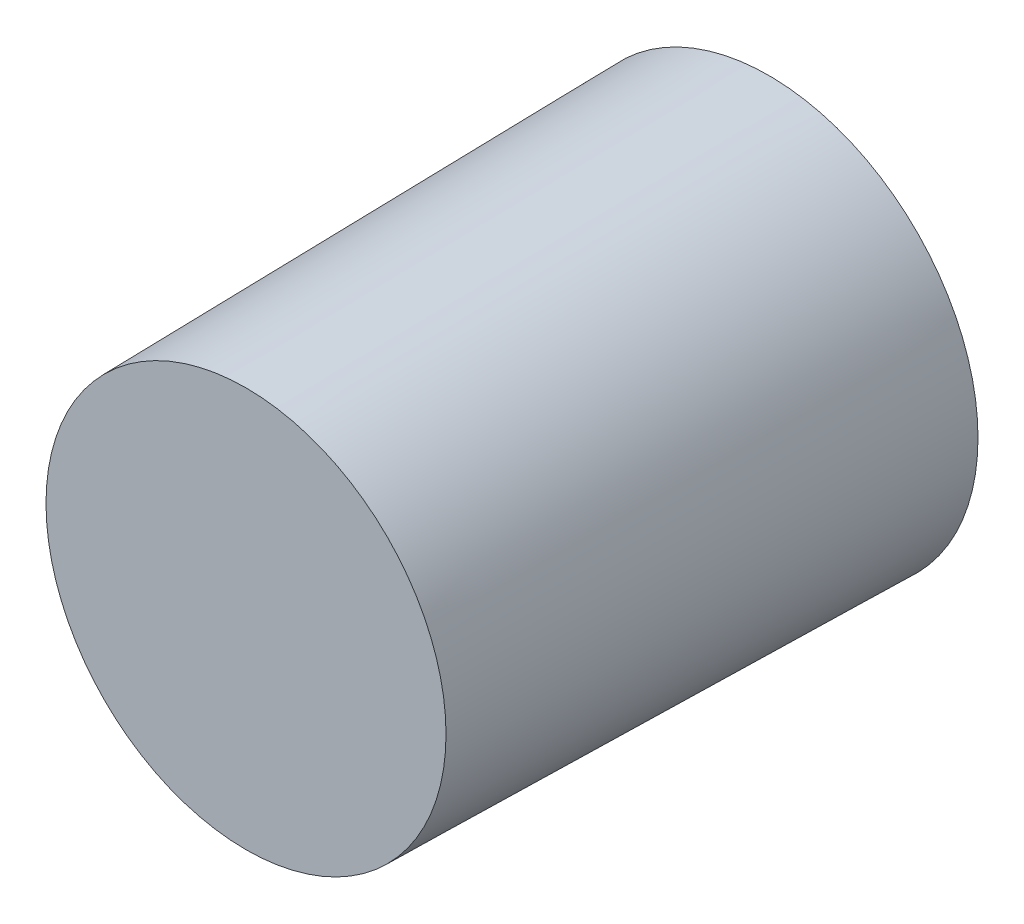
ISO-10303-21;
HEADER;
FILE_DESCRIPTION(('STEP AP214'),'2;1');
FILE_NAME('part.step','',(''),(''),'','','');
FILE_SCHEMA(('AUTOMOTIVE_DESIGN { 1 0 10303 214 1 1 1 1 }'));
ENDSEC;
DATA;
#1=APPLICATION_CONTEXT('core data for automotive mechanical design processes');
#2=APPLICATION_PROTOCOL_DEFINITION('international standard','automotive_design',2000,#1);
#3=PRODUCT_CONTEXT('',#1,'mechanical');
#4=PRODUCT('Part','Part','',(#3));
#5=PRODUCT_RELATED_PRODUCT_CATEGORY('part','',(#4));
#6=PRODUCT_DEFINITION_FORMATION('','',#4);
#7=PRODUCT_DEFINITION_CONTEXT('part definition',#1,'design');
#8=PRODUCT_DEFINITION('design','',#6,#7);
#9=PRODUCT_DEFINITION_SHAPE('','',#8);
#10=(LENGTH_UNIT() NAMED_UNIT(*) SI_UNIT(.MILLI.,.METRE.));
#11=(NAMED_UNIT(*) PLANE_ANGLE_UNIT() SI_UNIT($,.RADIAN.));
#12=(NAMED_UNIT(*) SI_UNIT($,.STERADIAN.) SOLID_ANGLE_UNIT());
#13=UNCERTAINTY_MEASURE_WITH_UNIT(LENGTH_MEASURE(1.E-05),#10,'distance_accuracy_value','');
#14=(GEOMETRIC_REPRESENTATION_CONTEXT(3) GLOBAL_UNCERTAINTY_ASSIGNED_CONTEXT((#13)) GLOBAL_UNIT_ASSIGNED_CONTEXT((#10,
#11,#12)) REPRESENTATION_CONTEXT('',''));
#15=CARTESIAN_POINT('',(0.,0.,0.));
#16=DIRECTION('',(0.,0.,1.));
#17=DIRECTION('',(1.,0.,0.));
#18=AXIS2_PLACEMENT_3D('',#15,#16,#17);
#19=CARTESIAN_POINT('',(0.,0.,0.));
#20=DIRECTION('',(0.,0.,-1.));
#21=DIRECTION('',(1.,0.,0.));
#22=AXIS2_PLACEMENT_3D('',#19,#20,#21);
#23=CONICAL_SURFACE('',#22,10.,0.0174532925199433);
#24=CARTESIAN_POINT('',(0.,0.,25.));
#25=DIRECTION('',(0.,0.,1.));
#26=DIRECTION('',(1.,0.,0.));
#27=AXIS2_PLACEMENT_3D('',#24,#25,#26);
#28=CIRCLE('',#27,9.56362337679456);
#29=CARTESIAN_POINT('',(9.56362337679456,0.,25.));
#30=VERTEX_POINT('',#29);
#31=EDGE_CURVE('E11',#30,#30,#28,.T.);
#32=ORIENTED_EDGE('',*,*,#31,.F.);
#33=EDGE_LOOP('',(#32));
#34=FACE_BOUND('',#33,.T.);
#35=CARTESIAN_POINT('',(0.,0.,0.));
#36=DIRECTION('',(0.,0.,1.));
#37=DIRECTION('',(1.,0.,0.));
#38=AXIS2_PLACEMENT_3D('',#35,#36,#37);
#39=CIRCLE('',#38,10.);
#40=CARTESIAN_POINT('',(10.,0.,0.));
#41=VERTEX_POINT('',#40);
#42=EDGE_CURVE('E50',#41,#41,#39,.T.);
#43=ORIENTED_EDGE('',*,*,#42,.T.);
#44=EDGE_LOOP('',(#43));
#45=FACE_BOUND('',#44,.T.);
#46=ADVANCED_FACE('F43',(#34,#45),#23,.T.);
#47=CARTESIAN_POINT('',(0.,0.,25.));
#48=DIRECTION('',(0.,0.,1.));
#49=DIRECTION('',(1.,0.,0.));
#50=AXIS2_PLACEMENT_3D('',#47,#48,#49);
#51=PLANE('',#50);
#52=ORIENTED_EDGE('',*,*,#31,.T.);
#53=EDGE_LOOP('',(#52));
#54=FACE_BOUND('',#53,.T.);
#55=ADVANCED_FACE('F127',(#54),#51,.T.);
#56=CARTESIAN_POINT('',(0.,0.,0.));
#57=DIRECTION('',(0.,0.,1.));
#58=DIRECTION('',(1.,0.,0.));
#59=AXIS2_PLACEMENT_3D('',#56,#57,#58);
#60=PLANE('',#59);
#61=DIRECTION('',(0.,-1.,0.));
#62=VECTOR('',#61,1.);
#63=CARTESIAN_POINT('',(-2.5,0.,0.));
#64=LINE('',#63,#62);
#65=CARTESIAN_POINT('',(-2.5,2.5,0.));
#66=VERTEX_POINT('',#65);
#67=CARTESIAN_POINT('',(-2.5,-2.5,0.));
#68=VERTEX_POINT('',#67);
#69=EDGE_CURVE('E57',#66,#68,#64,.T.);
#70=ORIENTED_EDGE('',*,*,#69,.T.);
#71=CARTESIAN_POINT('',(0.,-2.5,0.));
#72=DIRECTION('',(0.,0.,1.));
#73=DIRECTION('',(1.,0.,0.));
#74=AXIS2_PLACEMENT_3D('',#71,#72,#73);
#75=CIRCLE('',#74,2.5);
#76=CARTESIAN_POINT('',(2.5,-2.5,0.));
#77=VERTEX_POINT('',#76);
#78=EDGE_CURVE('E112',#68,#77,#75,.T.);
#79=ORIENTED_EDGE('',*,*,#78,.T.);
#80=DIRECTION('',(0.,-1.,0.));
#81=VECTOR('',#80,1.);
#82=CARTESIAN_POINT('',(2.5,0.,0.));
#83=LINE('',#82,#81);
#84=CARTESIAN_POINT('',(2.5,2.5,0.));
#85=VERTEX_POINT('',#84);
#86=EDGE_CURVE('E102',#85,#77,#83,.T.);
#87=ORIENTED_EDGE('',*,*,#86,.F.);
#88=CARTESIAN_POINT('',(0.,2.5,0.));
#89=DIRECTION('',(0.,0.,1.));
#90=DIRECTION('',(1.,0.,0.));
#91=AXIS2_PLACEMENT_3D('',#88,#89,#90);
#92=CIRCLE('',#91,2.5);
#93=EDGE_CURVE('E115',#85,#66,#92,.T.);
#94=ORIENTED_EDGE('',*,*,#93,.T.);
#95=EDGE_LOOP('',(#70,#79,#87,#94));
#96=FACE_BOUND('',#95,.T.);
#97=ORIENTED_EDGE('',*,*,#42,.F.);
#98=EDGE_LOOP('',(#97));
#99=FACE_BOUND('',#98,.T.);
#100=ADVANCED_FACE('F124',(#96,#99),#60,.F.);
#101=CARTESIAN_POINT('',(-2.5,0.,2.));
#102=DIRECTION('',(1.,0.,0.));
#103=DIRECTION('',(0.,0.,-1.));
#104=AXIS2_PLACEMENT_3D('',#101,#102,#103);
#105=PLANE('',#104);
#106=ORIENTED_EDGE('',*,*,#69,.F.);
#107=DIRECTION('',(0.,0.,-1.));
#108=VECTOR('',#107,1.);
#109=CARTESIAN_POINT('',(-2.5,2.5,2.));
#110=LINE('',#109,#108);
#111=CARTESIAN_POINT('',(-2.5,2.5,2.));
#112=VERTEX_POINT('',#111);
#113=EDGE_CURVE('E107',#112,#66,#110,.T.);
#114=ORIENTED_EDGE('',*,*,#113,.F.);
#115=DIRECTION('',(0.,-1.,0.));
#116=VECTOR('',#115,1.);
#117=CARTESIAN_POINT('',(-2.5,0.,2.));
#118=LINE('',#117,#116);
#119=CARTESIAN_POINT('',(-2.5,-2.5,2.));
#120=VERTEX_POINT('',#119);
#121=EDGE_CURVE('E98',#112,#120,#118,.T.);
#122=ORIENTED_EDGE('',*,*,#121,.T.);
#123=DIRECTION('',(0.,0.,-1.));
#124=VECTOR('',#123,1.);
#125=CARTESIAN_POINT('',(-2.5,-2.5,2.));
#126=LINE('',#125,#124);
#127=EDGE_CURVE('E96',#120,#68,#126,.T.);
#128=ORIENTED_EDGE('',*,*,#127,.T.);
#129=EDGE_LOOP('',(#106,#114,#122,#128));
#130=FACE_BOUND('',#129,.T.);
#131=ADVANCED_FACE('F126',(#130),#105,.T.);
#132=CARTESIAN_POINT('',(0.,-2.5,2.));
#133=DIRECTION('',(0.,0.,-1.));
#134=DIRECTION('',(-1.,0.,0.));
#135=AXIS2_PLACEMENT_3D('',#132,#133,#134);
#136=CYLINDRICAL_SURFACE('',#135,2.5);
#137=ORIENTED_EDGE('',*,*,#78,.F.);
#138=ORIENTED_EDGE('',*,*,#127,.F.);
#139=CARTESIAN_POINT('',(0.,-2.5,2.));
#140=DIRECTION('',(0.,0.,1.));
#141=DIRECTION('',(1.,0.,0.));
#142=AXIS2_PLACEMENT_3D('',#139,#140,#141);
#143=CIRCLE('',#142,2.5);
#144=CARTESIAN_POINT('',(2.5,-2.5,2.));
#145=VERTEX_POINT('',#144);
#146=EDGE_CURVE('E89',#120,#145,#143,.T.);
#147=ORIENTED_EDGE('',*,*,#146,.T.);
#148=DIRECTION('',(0.,0.,-1.));
#149=VECTOR('',#148,1.);
#150=CARTESIAN_POINT('',(2.5,-2.5,2.));
#151=LINE('',#150,#149);
#152=EDGE_CURVE('E95',#145,#77,#151,.T.);
#153=ORIENTED_EDGE('',*,*,#152,.T.);
#154=EDGE_LOOP('',(#137,#138,#147,#153));
#155=FACE_BOUND('',#154,.T.);
#156=ADVANCED_FACE('F94',(#155),#136,.F.);
#157=CARTESIAN_POINT('',(2.5,0.,2.));
#158=DIRECTION('',(1.,0.,0.));
#159=DIRECTION('',(0.,0.,-1.));
#160=AXIS2_PLACEMENT_3D('',#157,#158,#159);
#161=PLANE('',#160);
#162=ORIENTED_EDGE('',*,*,#86,.T.);
#163=ORIENTED_EDGE('',*,*,#152,.F.);
#164=DIRECTION('',(0.,-1.,0.));
#165=VECTOR('',#164,1.);
#166=CARTESIAN_POINT('',(2.5,0.,2.));
#167=LINE('',#166,#165);
#168=CARTESIAN_POINT('',(2.5,2.5,2.));
#169=VERTEX_POINT('',#168);
#170=EDGE_CURVE('E97',#169,#145,#167,.T.);
#171=ORIENTED_EDGE('',*,*,#170,.F.);
#172=DIRECTION('',(0.,0.,-1.));
#173=VECTOR('',#172,1.);
#174=CARTESIAN_POINT('',(2.5,2.5,2.));
#175=LINE('',#174,#173);
#176=EDGE_CURVE('E81',#169,#85,#175,.T.);
#177=ORIENTED_EDGE('',*,*,#176,.T.);
#178=EDGE_LOOP('',(#162,#163,#171,#177));
#179=FACE_BOUND('',#178,.T.);
#180=ADVANCED_FACE('F100',(#179),#161,.F.);
#181=CARTESIAN_POINT('',(0.,2.5,2.));
#182=DIRECTION('',(0.,0.,-1.));
#183=DIRECTION('',(-1.,0.,0.));
#184=AXIS2_PLACEMENT_3D('',#181,#182,#183);
#185=CYLINDRICAL_SURFACE('',#184,2.5);
#186=ORIENTED_EDGE('',*,*,#93,.F.);
#187=ORIENTED_EDGE('',*,*,#176,.F.);
#188=CARTESIAN_POINT('',(0.,2.5,2.));
#189=DIRECTION('',(0.,0.,1.));
#190=DIRECTION('',(1.,0.,0.));
#191=AXIS2_PLACEMENT_3D('',#188,#189,#190);
#192=CIRCLE('',#191,2.5);
#193=EDGE_CURVE('E65',#169,#112,#192,.T.);
#194=ORIENTED_EDGE('',*,*,#193,.T.);
#195=ORIENTED_EDGE('',*,*,#113,.T.);
#196=EDGE_LOOP('',(#186,#187,#194,#195));
#197=FACE_BOUND('',#196,.T.);
#198=ADVANCED_FACE('F181',(#197),#185,.F.);
#199=CARTESIAN_POINT('',(0.,0.,2.));
#200=DIRECTION('',(0.,0.,1.));
#201=DIRECTION('',(1.,0.,0.));
#202=AXIS2_PLACEMENT_3D('',#199,#200,#201);
#203=PLANE('',#202);
#204=ORIENTED_EDGE('',*,*,#121,.F.);
#205=ORIENTED_EDGE('',*,*,#193,.F.);
#206=ORIENTED_EDGE('',*,*,#170,.T.);
#207=ORIENTED_EDGE('',*,*,#146,.F.);
#208=EDGE_LOOP('',(#204,#205,#206,#207));
#209=FACE_BOUND('',#208,.T.);
#210=ADVANCED_FACE('F105',(#209),#203,.F.);
#211=CLOSED_SHELL('',(#46,#55,#100,#131,#156,#180,#198,#210));
#212=MANIFOLD_SOLID_BREP('B2',#211);
#213=ADVANCED_BREP_SHAPE_REPRESENTATION('',(#18,#212),#14);
#214=SHAPE_DEFINITION_REPRESENTATION(#9,#213);
ENDSEC;
END-ISO-10303-21;
